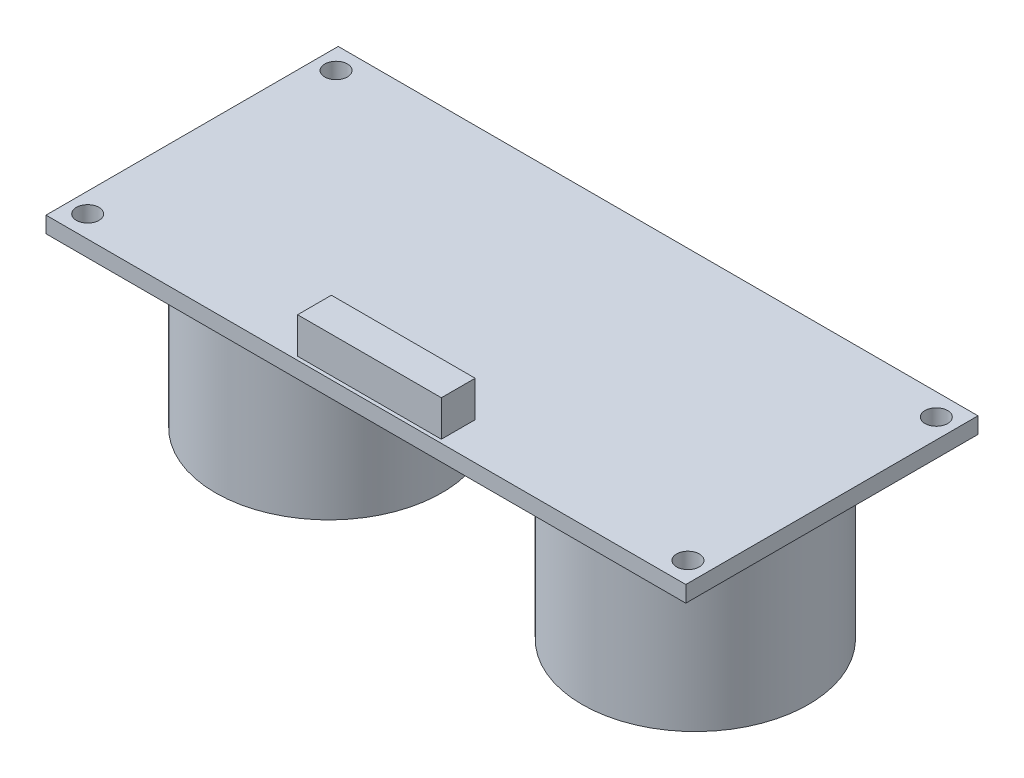
ISO-10303-21;
HEADER;
FILE_DESCRIPTION(('STEP AP214'),'2;1');
FILE_NAME('part.step','',(''),(''),'','','');
FILE_SCHEMA(('AUTOMOTIVE_DESIGN { 1 0 10303 214 1 1 1 1 }'));
ENDSEC;
DATA;
#1=APPLICATION_CONTEXT('core data for automotive mechanical design processes');
#2=APPLICATION_PROTOCOL_DEFINITION('international standard','automotive_design',2000,#1);
#3=PRODUCT_CONTEXT('',#1,'mechanical');
#4=PRODUCT('Part','Part','',(#3));
#5=PRODUCT_RELATED_PRODUCT_CATEGORY('part','',(#4));
#6=PRODUCT_DEFINITION_FORMATION('','',#4);
#7=PRODUCT_DEFINITION_CONTEXT('part definition',#1,'design');
#8=PRODUCT_DEFINITION('design','',#6,#7);
#9=PRODUCT_DEFINITION_SHAPE('','',#8);
#10=(LENGTH_UNIT() NAMED_UNIT(*) SI_UNIT(.MILLI.,.METRE.));
#11=(NAMED_UNIT(*) PLANE_ANGLE_UNIT() SI_UNIT($,.RADIAN.));
#12=(NAMED_UNIT(*) SI_UNIT($,.STERADIAN.) SOLID_ANGLE_UNIT());
#13=UNCERTAINTY_MEASURE_WITH_UNIT(LENGTH_MEASURE(1.E-05),#10,'distance_accuracy_value','');
#14=(GEOMETRIC_REPRESENTATION_CONTEXT(3) GLOBAL_UNCERTAINTY_ASSIGNED_CONTEXT((#13)) GLOBAL_UNIT_ASSIGNED_CONTEXT((#10,
#11,#12)) REPRESENTATION_CONTEXT('',''));
#15=CARTESIAN_POINT('',(0.,0.,0.));
#16=DIRECTION('',(0.,0.,1.));
#17=DIRECTION('',(1.,0.,0.));
#18=AXIS2_PLACEMENT_3D('',#15,#16,#17);
#19=CARTESIAN_POINT('',(0.,0.5715,0.));
#20=DIRECTION('',(0.,1.,0.));
#21=DIRECTION('',(0.,0.,1.));
#22=AXIS2_PLACEMENT_3D('',#19,#20,#21);
#23=PLANE('',#22);
#24=DIRECTION('',(0.,0.,1.));
#25=VECTOR('',#24,1.);
#26=CARTESIAN_POINT('',(22.606,0.5715,0.));
#27=LINE('',#26,#25);
#28=CARTESIAN_POINT('',(22.606,0.5715,-10.3251));
#29=VERTEX_POINT('',#28);
#30=CARTESIAN_POINT('',(22.606,0.5715,10.3251));
#31=VERTEX_POINT('',#30);
#32=EDGE_CURVE('E150',#29,#31,#27,.T.);
#33=ORIENTED_EDGE('',*,*,#32,.F.);
#34=DIRECTION('',(-1.,0.,0.));
#35=VECTOR('',#34,1.);
#36=CARTESIAN_POINT('',(0.,0.5715,-10.3251));
#37=LINE('',#36,#35);
#38=CARTESIAN_POINT('',(-22.606,0.5715,-10.3251));
#39=VERTEX_POINT('',#38);
#40=EDGE_CURVE('E194',#29,#39,#37,.T.);
#41=ORIENTED_EDGE('',*,*,#40,.T.);
#42=DIRECTION('',(0.,0.,1.));
#43=VECTOR('',#42,1.);
#44=CARTESIAN_POINT('',(-22.606,0.5715,0.));
#45=LINE('',#44,#43);
#46=CARTESIAN_POINT('',(-22.606,0.5715,10.3251));
#47=VERTEX_POINT('',#46);
#48=EDGE_CURVE('E196',#39,#47,#45,.T.);
#49=ORIENTED_EDGE('',*,*,#48,.T.);
#50=DIRECTION('',(-1.,0.,0.));
#51=VECTOR('',#50,1.);
#52=CARTESIAN_POINT('',(0.,0.5715,10.3251));
#53=LINE('',#52,#51);
#54=EDGE_CURVE('E179',#31,#47,#53,.T.);
#55=ORIENTED_EDGE('',*,*,#54,.F.);
#56=EDGE_LOOP('',(#33,#41,#49,#55));
#57=FACE_BOUND('',#56,.T.);
#58=DIRECTION('',(-1.,0.,0.));
#59=VECTOR('',#58,1.);
#60=CARTESIAN_POINT('',(-5.08,0.5715,7.6835));
#61=LINE('',#60,#59);
#62=CARTESIAN_POINT('',(5.08,0.5715,7.6835));
#63=VERTEX_POINT('',#62);
#64=CARTESIAN_POINT('',(-5.08,0.5715,7.6835));
#65=VERTEX_POINT('',#64);
#66=EDGE_CURVE('E161',#63,#65,#61,.T.);
#67=ORIENTED_EDGE('',*,*,#66,.F.);
#68=DIRECTION('',(0.,0.,1.));
#69=VECTOR('',#68,1.);
#70=CARTESIAN_POINT('',(5.08,0.5715,10.0711));
#71=LINE('',#70,#69);
#72=CARTESIAN_POINT('',(5.08,0.5715,10.0711));
#73=VERTEX_POINT('',#72);
#74=EDGE_CURVE('E126',#63,#73,#71,.T.);
#75=ORIENTED_EDGE('',*,*,#74,.T.);
#76=DIRECTION('',(1.,0.,0.));
#77=VECTOR('',#76,1.);
#78=CARTESIAN_POINT('',(-5.08,0.5715,10.0711));
#79=LINE('',#78,#77);
#80=CARTESIAN_POINT('',(-5.08,0.5715,10.0711));
#81=VERTEX_POINT('',#80);
#82=EDGE_CURVE('E60',#81,#73,#79,.T.);
#83=ORIENTED_EDGE('',*,*,#82,.F.);
#84=DIRECTION('',(0.,0.,1.));
#85=VECTOR('',#84,1.);
#86=CARTESIAN_POINT('',(-5.08,0.5715,10.0711));
#87=LINE('',#86,#85);
#88=EDGE_CURVE('E55',#65,#81,#87,.T.);
#89=ORIENTED_EDGE('',*,*,#88,.F.);
#90=EDGE_LOOP('',(#67,#75,#83,#89));
#91=FACE_BOUND('',#90,.T.);
#92=CARTESIAN_POINT('',(-21.209,0.5715,-8.7757));
#93=DIRECTION('',(0.,1.,0.));
#94=DIRECTION('',(0.,0.,1.));
#95=AXIS2_PLACEMENT_3D('',#92,#93,#94);
#96=CIRCLE('',#95,0.799999999999999);
#97=CARTESIAN_POINT('',(-21.209,0.5715,-7.9757));
#98=VERTEX_POINT('',#97);
#99=EDGE_CURVE('E188',#98,#98,#96,.T.);
#100=ORIENTED_EDGE('',*,*,#99,.F.);
#101=EDGE_LOOP('',(#100));
#102=FACE_BOUND('',#101,.T.);
#103=CARTESIAN_POINT('',(-21.209,0.5715,8.7757));
#104=DIRECTION('',(0.,-1.,0.));
#105=DIRECTION('',(0.,0.,-1.));
#106=AXIS2_PLACEMENT_3D('',#103,#104,#105);
#107=CIRCLE('',#106,0.799999999999999);
#108=CARTESIAN_POINT('',(-21.209,0.5715,7.9757));
#109=VERTEX_POINT('',#108);
#110=EDGE_CURVE('E173',#109,#109,#107,.T.);
#111=ORIENTED_EDGE('',*,*,#110,.T.);
#112=EDGE_LOOP('',(#111));
#113=FACE_BOUND('',#112,.T.);
#114=CARTESIAN_POINT('',(21.209,0.5715,-8.7757));
#115=DIRECTION('',(0.,-1.,0.));
#116=DIRECTION('',(0.,0.,1.));
#117=AXIS2_PLACEMENT_3D('',#114,#115,#116);
#118=CIRCLE('',#117,0.799999999999999);
#119=CARTESIAN_POINT('',(21.209,0.5715,-7.9757));
#120=VERTEX_POINT('',#119);
#121=EDGE_CURVE('E144',#120,#120,#118,.T.);
#122=ORIENTED_EDGE('',*,*,#121,.T.);
#123=EDGE_LOOP('',(#122));
#124=FACE_BOUND('',#123,.T.);
#125=CARTESIAN_POINT('',(21.209,0.5715,8.7757));
#126=DIRECTION('',(0.,1.,0.));
#127=DIRECTION('',(0.,0.,-1.));
#128=AXIS2_PLACEMENT_3D('',#125,#126,#127);
#129=CIRCLE('',#128,0.799999999999999);
#130=CARTESIAN_POINT('',(21.209,0.5715,7.9757));
#131=VERTEX_POINT('',#130);
#132=EDGE_CURVE('E135',#131,#131,#129,.T.);
#133=ORIENTED_EDGE('',*,*,#132,.F.);
#134=EDGE_LOOP('',(#133));
#135=FACE_BOUND('',#134,.T.);
#136=ADVANCED_FACE('F39',(#57,#91,#102,#113,#124,#135),#23,.T.);
#137=CARTESIAN_POINT('',(0.,-0.5715,0.));
#138=DIRECTION('',(0.,1.,0.));
#139=DIRECTION('',(0.,0.,1.));
#140=AXIS2_PLACEMENT_3D('',#137,#138,#139);
#141=PLANE('',#140);
#142=CARTESIAN_POINT('',(-12.954,-0.5715,0.));
#143=DIRECTION('',(0.,-1.,0.));
#144=DIRECTION('',(0.,0.,-1.));
#145=AXIS2_PLACEMENT_3D('',#142,#143,#144);
#146=CIRCLE('',#145,8.001);
#147=CARTESIAN_POINT('',(-12.954,-0.571500000000001,8.001));
#148=VERTEX_POINT('',#147);
#149=EDGE_CURVE('E11',#148,#148,#146,.T.);
#150=ORIENTED_EDGE('',*,*,#149,.F.);
#151=EDGE_LOOP('',(#150));
#152=FACE_BOUND('',#151,.T.);
#153=DIRECTION('',(-1.,0.,0.));
#154=VECTOR('',#153,1.);
#155=CARTESIAN_POINT('',(0.,-0.5715,-10.3251));
#156=LINE('',#155,#154);
#157=CARTESIAN_POINT('',(22.606,-0.5715,-10.3251));
#158=VERTEX_POINT('',#157);
#159=CARTESIAN_POINT('',(-22.606,-0.5715,-10.3251));
#160=VERTEX_POINT('',#159);
#161=EDGE_CURVE('E191',#158,#160,#156,.T.);
#162=ORIENTED_EDGE('',*,*,#161,.F.);
#163=DIRECTION('',(0.,0.,1.));
#164=VECTOR('',#163,1.);
#165=CARTESIAN_POINT('',(22.606,-0.5715,0.));
#166=LINE('',#165,#164);
#167=CARTESIAN_POINT('',(22.606,-0.5715,10.3251));
#168=VERTEX_POINT('',#167);
#169=EDGE_CURVE('E147',#158,#168,#166,.T.);
#170=ORIENTED_EDGE('',*,*,#169,.T.);
#171=DIRECTION('',(-1.,0.,0.));
#172=VECTOR('',#171,1.);
#173=CARTESIAN_POINT('',(0.,-0.5715,10.3251));
#174=LINE('',#173,#172);
#175=CARTESIAN_POINT('',(-22.606,-0.5715,10.3251));
#176=VERTEX_POINT('',#175);
#177=EDGE_CURVE('E176',#168,#176,#174,.T.);
#178=ORIENTED_EDGE('',*,*,#177,.T.);
#179=DIRECTION('',(0.,0.,1.));
#180=VECTOR('',#179,1.);
#181=CARTESIAN_POINT('',(-22.606,-0.5715,0.));
#182=LINE('',#181,#180);
#183=EDGE_CURVE('E197',#160,#176,#182,.T.);
#184=ORIENTED_EDGE('',*,*,#183,.F.);
#185=EDGE_LOOP('',(#162,#170,#178,#184));
#186=FACE_BOUND('',#185,.T.);
#187=CARTESIAN_POINT('',(-21.209,-0.5715,-8.7757));
#188=DIRECTION('',(0.,1.,0.));
#189=DIRECTION('',(0.,0.,1.));
#190=AXIS2_PLACEMENT_3D('',#187,#188,#189);
#191=CIRCLE('',#190,0.799999999999999);
#192=CARTESIAN_POINT('',(-21.209,-0.5715,-7.9757));
#193=VERTEX_POINT('',#192);
#194=EDGE_CURVE('E187',#193,#193,#191,.T.);
#195=ORIENTED_EDGE('',*,*,#194,.T.);
#196=EDGE_LOOP('',(#195));
#197=FACE_BOUND('',#196,.T.);
#198=CARTESIAN_POINT('',(-21.209,-0.5715,8.7757));
#199=DIRECTION('',(0.,-1.,0.));
#200=DIRECTION('',(0.,0.,-1.));
#201=AXIS2_PLACEMENT_3D('',#198,#199,#200);
#202=CIRCLE('',#201,0.799999999999999);
#203=CARTESIAN_POINT('',(-21.209,-0.5715,7.9757));
#204=VERTEX_POINT('',#203);
#205=EDGE_CURVE('E172',#204,#204,#202,.T.);
#206=ORIENTED_EDGE('',*,*,#205,.F.);
#207=EDGE_LOOP('',(#206));
#208=FACE_BOUND('',#207,.T.);
#209=CARTESIAN_POINT('',(12.954,-0.5715,0.));
#210=DIRECTION('',(0.,1.,0.));
#211=DIRECTION('',(0.,0.,-1.));
#212=AXIS2_PLACEMENT_3D('',#209,#210,#211);
#213=CIRCLE('',#212,8.001);
#214=CARTESIAN_POINT('',(12.954,-0.571500000000001,8.001));
#215=VERTEX_POINT('',#214);
#216=EDGE_CURVE('E132',#215,#215,#213,.T.);
#217=ORIENTED_EDGE('',*,*,#216,.T.);
#218=EDGE_LOOP('',(#217));
#219=FACE_BOUND('',#218,.T.);
#220=CARTESIAN_POINT('',(21.209,-0.5715,-8.7757));
#221=DIRECTION('',(0.,-1.,0.));
#222=DIRECTION('',(0.,0.,1.));
#223=AXIS2_PLACEMENT_3D('',#220,#221,#222);
#224=CIRCLE('',#223,0.799999999999999);
#225=CARTESIAN_POINT('',(21.209,-0.5715,-7.9757));
#226=VERTEX_POINT('',#225);
#227=EDGE_CURVE('E143',#226,#226,#224,.T.);
#228=ORIENTED_EDGE('',*,*,#227,.F.);
#229=EDGE_LOOP('',(#228));
#230=FACE_BOUND('',#229,.T.);
#231=CARTESIAN_POINT('',(21.209,-0.5715,8.7757));
#232=DIRECTION('',(0.,1.,0.));
#233=DIRECTION('',(0.,0.,-1.));
#234=AXIS2_PLACEMENT_3D('',#231,#232,#233);
#235=CIRCLE('',#234,0.799999999999999);
#236=CARTESIAN_POINT('',(21.209,-0.5715,7.9757));
#237=VERTEX_POINT('',#236);
#238=EDGE_CURVE('E121',#237,#237,#235,.T.);
#239=ORIENTED_EDGE('',*,*,#238,.T.);
#240=EDGE_LOOP('',(#239));
#241=FACE_BOUND('',#240,.T.);
#242=ADVANCED_FACE('F210',(#152,#186,#197,#208,#219,#230,#241),#141,.F.);
#243=CARTESIAN_POINT('',(0.,0.5715,-10.3251));
#244=DIRECTION('',(0.,0.,1.));
#245=DIRECTION('',(1.,0.,0.));
#246=AXIS2_PLACEMENT_3D('',#243,#244,#245);
#247=PLANE('',#246);
#248=ORIENTED_EDGE('',*,*,#161,.T.);
#249=DIRECTION('',(0.,-1.,0.));
#250=VECTOR('',#249,1.);
#251=CARTESIAN_POINT('',(-22.606,0.5715,-10.3251));
#252=LINE('',#251,#250);
#253=EDGE_CURVE('E43',#39,#160,#252,.T.);
#254=ORIENTED_EDGE('',*,*,#253,.F.);
#255=ORIENTED_EDGE('',*,*,#40,.F.);
#256=DIRECTION('',(0.,-1.,0.));
#257=VECTOR('',#256,1.);
#258=CARTESIAN_POINT('',(22.606,0.5715,-10.3251));
#259=LINE('',#258,#257);
#260=EDGE_CURVE('E153',#29,#158,#259,.T.);
#261=ORIENTED_EDGE('',*,*,#260,.T.);
#262=EDGE_LOOP('',(#248,#254,#255,#261));
#263=FACE_BOUND('',#262,.T.);
#264=ADVANCED_FACE('F41',(#263),#247,.F.);
#265=CARTESIAN_POINT('',(-22.606,0.5715,0.));
#266=DIRECTION('',(1.,0.,0.));
#267=DIRECTION('',(0.,0.,-1.));
#268=AXIS2_PLACEMENT_3D('',#265,#266,#267);
#269=PLANE('',#268);
#270=ORIENTED_EDGE('',*,*,#183,.T.);
#271=DIRECTION('',(0.,-1.,0.));
#272=VECTOR('',#271,1.);
#273=CARTESIAN_POINT('',(-22.606,0.5715,10.3251));
#274=LINE('',#273,#272);
#275=EDGE_CURVE('E182',#47,#176,#274,.T.);
#276=ORIENTED_EDGE('',*,*,#275,.F.);
#277=ORIENTED_EDGE('',*,*,#48,.F.);
#278=ORIENTED_EDGE('',*,*,#253,.T.);
#279=EDGE_LOOP('',(#270,#276,#277,#278));
#280=FACE_BOUND('',#279,.T.);
#281=ADVANCED_FACE('F203',(#280),#269,.F.);
#282=CARTESIAN_POINT('',(-21.209,0.5715,-8.7757));
#283=DIRECTION('',(0.,-1.,0.));
#284=DIRECTION('',(0.,0.,-1.));
#285=AXIS2_PLACEMENT_3D('',#282,#283,#284);
#286=CYLINDRICAL_SURFACE('',#285,0.799999999999999);
#287=ORIENTED_EDGE('',*,*,#99,.T.);
#288=EDGE_LOOP('',(#287));
#289=FACE_BOUND('',#288,.T.);
#290=ORIENTED_EDGE('',*,*,#194,.F.);
#291=EDGE_LOOP('',(#290));
#292=FACE_BOUND('',#291,.T.);
#293=ADVANCED_FACE('F224',(#289,#292),#286,.F.);
#294=CARTESIAN_POINT('',(0.,0.5715,10.3251));
#295=DIRECTION('',(0.,0.,1.));
#296=DIRECTION('',(1.,0.,0.));
#297=AXIS2_PLACEMENT_3D('',#294,#295,#296);
#298=PLANE('',#297);
#299=ORIENTED_EDGE('',*,*,#177,.F.);
#300=DIRECTION('',(0.,-1.,0.));
#301=VECTOR('',#300,1.);
#302=CARTESIAN_POINT('',(22.606,0.5715,10.3251));
#303=LINE('',#302,#301);
#304=EDGE_CURVE('E138',#31,#168,#303,.T.);
#305=ORIENTED_EDGE('',*,*,#304,.F.);
#306=ORIENTED_EDGE('',*,*,#54,.T.);
#307=ORIENTED_EDGE('',*,*,#275,.T.);
#308=EDGE_LOOP('',(#299,#305,#306,#307));
#309=FACE_BOUND('',#308,.T.);
#310=ADVANCED_FACE('F208',(#309),#298,.T.);
#311=CARTESIAN_POINT('',(-21.209,0.5715,8.7757));
#312=DIRECTION('',(0.,-1.,0.));
#313=DIRECTION('',(0.,0.,-1.));
#314=AXIS2_PLACEMENT_3D('',#311,#312,#313);
#315=CYLINDRICAL_SURFACE('',#314,0.799999999999999);
#316=ORIENTED_EDGE('',*,*,#110,.F.);
#317=EDGE_LOOP('',(#316));
#318=FACE_BOUND('',#317,.T.);
#319=ORIENTED_EDGE('',*,*,#205,.T.);
#320=EDGE_LOOP('',(#319));
#321=FACE_BOUND('',#320,.T.);
#322=ADVANCED_FACE('F237',(#318,#321),#315,.F.);
#323=CARTESIAN_POINT('',(-5.08,3.1115,10.0711));
#324=DIRECTION('',(1.,0.,0.));
#325=DIRECTION('',(0.,0.,-1.));
#326=AXIS2_PLACEMENT_3D('',#323,#324,#325);
#327=PLANE('',#326);
#328=ORIENTED_EDGE('',*,*,#88,.T.);
#329=DIRECTION('',(0.,-1.,0.));
#330=VECTOR('',#329,1.);
#331=CARTESIAN_POINT('',(-5.08,3.1115,10.0711));
#332=LINE('',#331,#330);
#333=CARTESIAN_POINT('',(-5.08,3.1115,10.0711));
#334=VERTEX_POINT('',#333);
#335=EDGE_CURVE('E170',#334,#81,#332,.T.);
#336=ORIENTED_EDGE('',*,*,#335,.F.);
#337=DIRECTION('',(0.,0.,1.));
#338=VECTOR('',#337,1.);
#339=CARTESIAN_POINT('',(-5.08,3.1115,10.0711));
#340=LINE('',#339,#338);
#341=CARTESIAN_POINT('',(-5.08,3.1115,7.6835));
#342=VERTEX_POINT('',#341);
#343=EDGE_CURVE('E111',#342,#334,#340,.T.);
#344=ORIENTED_EDGE('',*,*,#343,.F.);
#345=DIRECTION('',(0.,-1.,0.));
#346=VECTOR('',#345,1.);
#347=CARTESIAN_POINT('',(-5.08,3.1115,7.6835));
#348=LINE('',#347,#346);
#349=EDGE_CURVE('E164',#342,#65,#348,.T.);
#350=ORIENTED_EDGE('',*,*,#349,.T.);
#351=EDGE_LOOP('',(#328,#336,#344,#350));
#352=FACE_BOUND('',#351,.T.);
#353=ADVANCED_FACE('F240',(#352),#327,.F.);
#354=CARTESIAN_POINT('',(-5.08,3.1115,10.0711));
#355=DIRECTION('',(0.,0.,-1.));
#356=DIRECTION('',(-1.,0.,0.));
#357=AXIS2_PLACEMENT_3D('',#354,#355,#356);
#358=PLANE('',#357);
#359=ORIENTED_EDGE('',*,*,#82,.T.);
#360=DIRECTION('',(0.,-1.,0.));
#361=VECTOR('',#360,1.);
#362=CARTESIAN_POINT('',(5.08,3.1115,10.0711));
#363=LINE('',#362,#361);
#364=CARTESIAN_POINT('',(5.08,3.1115,10.0711));
#365=VERTEX_POINT('',#364);
#366=EDGE_CURVE('E117',#365,#73,#363,.T.);
#367=ORIENTED_EDGE('',*,*,#366,.F.);
#368=DIRECTION('',(1.,0.,0.));
#369=VECTOR('',#368,1.);
#370=CARTESIAN_POINT('',(-5.08,3.1115,10.0711));
#371=LINE('',#370,#369);
#372=EDGE_CURVE('E104',#334,#365,#371,.T.);
#373=ORIENTED_EDGE('',*,*,#372,.F.);
#374=ORIENTED_EDGE('',*,*,#335,.T.);
#375=EDGE_LOOP('',(#359,#367,#373,#374));
#376=FACE_BOUND('',#375,.T.);
#377=ADVANCED_FACE('F118',(#376),#358,.F.);
#378=CARTESIAN_POINT('',(-5.08,3.1115,7.6835));
#379=DIRECTION('',(0.,0.,1.));
#380=DIRECTION('',(1.,0.,0.));
#381=AXIS2_PLACEMENT_3D('',#378,#379,#380);
#382=PLANE('',#381);
#383=ORIENTED_EDGE('',*,*,#66,.T.);
#384=ORIENTED_EDGE('',*,*,#349,.F.);
#385=DIRECTION('',(-1.,0.,0.));
#386=VECTOR('',#385,1.);
#387=CARTESIAN_POINT('',(-5.08,3.1115,7.6835));
#388=LINE('',#387,#386);
#389=CARTESIAN_POINT('',(5.08,3.1115,7.6835));
#390=VERTEX_POINT('',#389);
#391=EDGE_CURVE('E114',#390,#342,#388,.T.);
#392=ORIENTED_EDGE('',*,*,#391,.F.);
#393=DIRECTION('',(0.,-1.,0.));
#394=VECTOR('',#393,1.);
#395=CARTESIAN_POINT('',(5.08,3.1115,7.6835));
#396=LINE('',#395,#394);
#397=EDGE_CURVE('E122',#390,#63,#396,.T.);
#398=ORIENTED_EDGE('',*,*,#397,.T.);
#399=EDGE_LOOP('',(#383,#384,#392,#398));
#400=FACE_BOUND('',#399,.T.);
#401=ADVANCED_FACE('F247',(#400),#382,.F.);
#402=CARTESIAN_POINT('',(0.,3.1115,0.));
#403=DIRECTION('',(0.,-1.,0.));
#404=DIRECTION('',(0.,0.,-1.));
#405=AXIS2_PLACEMENT_3D('',#402,#403,#404);
#406=PLANE('',#405);
#407=ORIENTED_EDGE('',*,*,#343,.T.);
#408=ORIENTED_EDGE('',*,*,#372,.T.);
#409=DIRECTION('',(0.,0.,1.));
#410=VECTOR('',#409,1.);
#411=CARTESIAN_POINT('',(5.08,3.1115,10.0711));
#412=LINE('',#411,#410);
#413=EDGE_CURVE('E108',#390,#365,#412,.T.);
#414=ORIENTED_EDGE('',*,*,#413,.F.);
#415=ORIENTED_EDGE('',*,*,#391,.T.);
#416=EDGE_LOOP('',(#407,#408,#414,#415));
#417=FACE_BOUND('',#416,.T.);
#418=ADVANCED_FACE('F106',(#417),#406,.F.);
#419=CARTESIAN_POINT('',(-12.954,-12.7635,0.));
#420=DIRECTION('',(0.,1.,0.));
#421=DIRECTION('',(0.,0.,1.));
#422=AXIS2_PLACEMENT_3D('',#419,#420,#421);
#423=CYLINDRICAL_SURFACE('',#422,8.001);
#424=CARTESIAN_POINT('',(-12.954,-12.7635,0.));
#425=DIRECTION('',(0.,-1.,0.));
#426=DIRECTION('',(0.,0.,-1.));
#427=AXIS2_PLACEMENT_3D('',#424,#425,#426);
#428=CIRCLE('',#427,8.001);
#429=CARTESIAN_POINT('',(-12.954,-12.7635,8.001));
#430=VERTEX_POINT('',#429);
#431=EDGE_CURVE('E158',#430,#430,#428,.T.);
#432=CARTESIAN_POINT('',(-12.954,-12.7635,8.001));
#433=CARTESIAN_POINT('',(-12.954,-12.6365,8.001));
#434=CARTESIAN_POINT('',(-12.954,-12.5095,8.001));
#435=CARTESIAN_POINT('',(-12.954,-12.2555,8.001));
#436=CARTESIAN_POINT('',(-12.954,-12.1285,8.001));
#437=CARTESIAN_POINT('',(-12.954,-11.8745,8.001));
#438=CARTESIAN_POINT('',(-12.954,-11.7475,8.001));
#439=CARTESIAN_POINT('',(-12.954,-11.4935,8.001));
#440=CARTESIAN_POINT('',(-12.954,-11.3665,8.001));
#441=CARTESIAN_POINT('',(-12.954,-11.1125,8.001));
#442=CARTESIAN_POINT('',(-12.954,-10.9855,8.001));
#443=CARTESIAN_POINT('',(-12.954,-10.7315,8.001));
#444=CARTESIAN_POINT('',(-12.954,-10.6045,8.001));
#445=CARTESIAN_POINT('',(-12.954,-10.3505,8.001));
#446=CARTESIAN_POINT('',(-12.954,-10.2235,8.001));
#447=CARTESIAN_POINT('',(-12.954,-9.9695,8.001));
#448=CARTESIAN_POINT('',(-12.954,-9.8425,8.001));
#449=CARTESIAN_POINT('',(-12.954,-9.5885,8.001));
#450=CARTESIAN_POINT('',(-12.954,-9.4615,8.001));
#451=CARTESIAN_POINT('',(-12.954,-9.2075,8.001));
#452=CARTESIAN_POINT('',(-12.954,-9.0805,8.001));
#453=CARTESIAN_POINT('',(-12.954,-8.8265,8.001));
#454=CARTESIAN_POINT('',(-12.954,-8.6995,8.001));
#455=CARTESIAN_POINT('',(-12.954,-8.4455,8.001));
#456=CARTESIAN_POINT('',(-12.954,-8.3185,8.001));
#457=CARTESIAN_POINT('',(-12.954,-8.0645,8.001));
#458=CARTESIAN_POINT('',(-12.954,-7.9375,8.001));
#459=CARTESIAN_POINT('',(-12.954,-7.6835,8.001));
#460=CARTESIAN_POINT('',(-12.954,-7.5565,8.001));
#461=CARTESIAN_POINT('',(-12.954,-7.3025,8.001));
#462=CARTESIAN_POINT('',(-12.954,-7.1755,8.001));
#463=CARTESIAN_POINT('',(-12.954,-6.9215,8.001));
#464=CARTESIAN_POINT('',(-12.954,-6.7945,8.001));
#465=CARTESIAN_POINT('',(-12.954,-6.5405,8.001));
#466=CARTESIAN_POINT('',(-12.954,-6.4135,8.001));
#467=CARTESIAN_POINT('',(-12.954,-6.1595,8.001));
#468=CARTESIAN_POINT('',(-12.954,-6.0325,8.001));
#469=CARTESIAN_POINT('',(-12.954,-5.7785,8.001));
#470=CARTESIAN_POINT('',(-12.954,-5.6515,8.001));
#471=CARTESIAN_POINT('',(-12.954,-5.3975,8.001));
#472=CARTESIAN_POINT('',(-12.954,-5.2705,8.001));
#473=CARTESIAN_POINT('',(-12.954,-5.0165,8.001));
#474=CARTESIAN_POINT('',(-12.954,-4.8895,8.001));
#475=CARTESIAN_POINT('',(-12.954,-4.6355,8.001));
#476=CARTESIAN_POINT('',(-12.954,-4.5085,8.001));
#477=CARTESIAN_POINT('',(-12.954,-4.2545,8.001));
#478=CARTESIAN_POINT('',(-12.954,-4.1275,8.001));
#479=CARTESIAN_POINT('',(-12.954,-3.8735,8.001));
#480=CARTESIAN_POINT('',(-12.954,-3.7465,8.001));
#481=CARTESIAN_POINT('',(-12.954,-3.4925,8.001));
#482=CARTESIAN_POINT('',(-12.954,-3.3655,8.001));
#483=CARTESIAN_POINT('',(-12.954,-3.1115,8.001));
#484=CARTESIAN_POINT('',(-12.954,-2.9845,8.001));
#485=CARTESIAN_POINT('',(-12.954,-2.7305,8.001));
#486=CARTESIAN_POINT('',(-12.954,-2.6035,8.001));
#487=CARTESIAN_POINT('',(-12.954,-2.3495,8.001));
#488=CARTESIAN_POINT('',(-12.954,-2.2225,8.001));
#489=CARTESIAN_POINT('',(-12.954,-1.9685,8.001));
#490=CARTESIAN_POINT('',(-12.954,-1.8415,8.001));
#491=CARTESIAN_POINT('',(-12.954,-1.5875,8.001));
#492=CARTESIAN_POINT('',(-12.954,-1.4605,8.001));
#493=CARTESIAN_POINT('',(-12.954,-1.2065,8.001));
#494=CARTESIAN_POINT('',(-12.954,-1.0795,8.001));
#495=CARTESIAN_POINT('',(-12.954,-0.8255,8.001));
#496=CARTESIAN_POINT('',(-12.954,-0.698500000000001,8.001));
#497=CARTESIAN_POINT('',(-12.954,-0.571500000000001,8.001));
#498=B_SPLINE_CURVE_WITH_KNOTS('',3,(#432,#433,#434,#435,#436,#437,#438,#439,#440,#441,#442,
#443,#444,#445,#446,#447,#448,#449,#450,#451,#452,#453,#454,#455,#456,#457,#458,#459,#460,#461,
#462,#463,#464,#465,#466,#467,#468,#469,#470,#471,#472,#473,#474,#475,#476,#477,#478,#479,#480,
#481,#482,#483,#484,#485,#486,#487,#488,#489,#490,#491,#492,#493,#494,#495,#496,#497),
.UNSPECIFIED.,.F.,.F.,(4,2,2,2,2,2,2,2,2,2,2,2,2,2,2,2,2,2,2,2,2,2,2,2,2,2,2,2,2,2,2,2,4),(0.,
0.380999999999999,0.761999999999999,1.143,1.524,1.905,2.286,2.667,3.048,3.429,3.81,4.191,4.572,
4.953,5.334,5.715,6.096,6.477,6.858,7.239,7.62,8.001,8.382,8.763,9.144,9.525,9.906,10.287,
10.668,11.049,11.43,11.811,12.192),.UNSPECIFIED.);
#499=EDGE_CURVE('BSEAM253',#430,#148,#498,.T.);
#500=ORIENTED_EDGE('',*,*,#431,.F.);
#501=ORIENTED_EDGE('',*,*,#149,.T.);
#502=ORIENTED_EDGE('',*,*,#499,.T.);
#503=ORIENTED_EDGE('',*,*,#499,.F.);
#504=EDGE_LOOP('',(#500,#502,#501,#503));
#505=FACE_BOUND('',#504,.T.);
#506=ADVANCED_FACE('F253',(#505),#423,.T.);
#507=CARTESIAN_POINT('',(-12.954,-12.7635,0.));
#508=DIRECTION('',(0.,-1.,0.));
#509=DIRECTION('',(0.,0.,-1.));
#510=AXIS2_PLACEMENT_3D('',#507,#508,#509);
#511=PLANE('',#510);
#512=ORIENTED_EDGE('',*,*,#431,.T.);
#513=EDGE_LOOP('',(#512));
#514=FACE_BOUND('',#513,.T.);
#515=ADVANCED_FACE('F256',(#514),#511,.T.);
#516=CARTESIAN_POINT('',(22.606,0.5715,0.));
#517=DIRECTION('',(-1.,0.,0.));
#518=DIRECTION('',(0.,0.,-1.));
#519=AXIS2_PLACEMENT_3D('',#516,#517,#518);
#520=PLANE('',#519);
#521=ORIENTED_EDGE('',*,*,#169,.F.);
#522=ORIENTED_EDGE('',*,*,#260,.F.);
#523=ORIENTED_EDGE('',*,*,#32,.T.);
#524=ORIENTED_EDGE('',*,*,#304,.T.);
#525=EDGE_LOOP('',(#521,#522,#523,#524));
#526=FACE_BOUND('',#525,.T.);
#527=ADVANCED_FACE('F215',(#526),#520,.F.);
#528=CARTESIAN_POINT('',(21.209,0.5715,-8.7757));
#529=DIRECTION('',(0.,-1.,0.));
#530=DIRECTION('',(0.,0.,-1.));
#531=AXIS2_PLACEMENT_3D('',#528,#529,#530);
#532=CYLINDRICAL_SURFACE('',#531,0.799999999999999);
#533=ORIENTED_EDGE('',*,*,#121,.F.);
#534=EDGE_LOOP('',(#533));
#535=FACE_BOUND('',#534,.T.);
#536=ORIENTED_EDGE('',*,*,#227,.T.);
#537=EDGE_LOOP('',(#536));
#538=FACE_BOUND('',#537,.T.);
#539=ADVANCED_FACE('F263',(#535,#538),#532,.F.);
#540=CARTESIAN_POINT('',(21.209,0.5715,8.7757));
#541=DIRECTION('',(0.,-1.,0.));
#542=DIRECTION('',(0.,0.,-1.));
#543=AXIS2_PLACEMENT_3D('',#540,#541,#542);
#544=CYLINDRICAL_SURFACE('',#543,0.799999999999999);
#545=ORIENTED_EDGE('',*,*,#132,.T.);
#546=EDGE_LOOP('',(#545));
#547=FACE_BOUND('',#546,.T.);
#548=ORIENTED_EDGE('',*,*,#238,.F.);
#549=EDGE_LOOP('',(#548));
#550=FACE_BOUND('',#549,.T.);
#551=ADVANCED_FACE('F266',(#547,#550),#544,.F.);
#552=CARTESIAN_POINT('',(5.08,3.1115,10.0711));
#553=DIRECTION('',(-1.,0.,0.));
#554=DIRECTION('',(0.,0.,-1.));
#555=AXIS2_PLACEMENT_3D('',#552,#553,#554);
#556=PLANE('',#555);
#557=ORIENTED_EDGE('',*,*,#74,.F.);
#558=ORIENTED_EDGE('',*,*,#397,.F.);
#559=ORIENTED_EDGE('',*,*,#413,.T.);
#560=ORIENTED_EDGE('',*,*,#366,.T.);
#561=EDGE_LOOP('',(#557,#558,#559,#560));
#562=FACE_BOUND('',#561,.T.);
#563=ADVANCED_FACE('F124',(#562),#556,.F.);
#564=CARTESIAN_POINT('',(12.954,-12.7635,0.));
#565=DIRECTION('',(0.,1.,0.));
#566=DIRECTION('',(0.,0.,1.));
#567=AXIS2_PLACEMENT_3D('',#564,#565,#566);
#568=CYLINDRICAL_SURFACE('',#567,8.001);
#569=CARTESIAN_POINT('',(12.954,-12.7635,0.));
#570=DIRECTION('',(0.,1.,0.));
#571=DIRECTION('',(0.,0.,-1.));
#572=AXIS2_PLACEMENT_3D('',#569,#570,#571);
#573=CIRCLE('',#572,8.001);
#574=CARTESIAN_POINT('',(12.954,-12.7635,8.001));
#575=VERTEX_POINT('',#574);
#576=EDGE_CURVE('E129',#575,#575,#573,.T.);
#577=CARTESIAN_POINT('',(12.954,-12.7635,8.001));
#578=CARTESIAN_POINT('',(12.954,-12.6365,8.001));
#579=CARTESIAN_POINT('',(12.954,-12.5095,8.001));
#580=CARTESIAN_POINT('',(12.954,-12.2555,8.001));
#581=CARTESIAN_POINT('',(12.954,-12.1285,8.001));
#582=CARTESIAN_POINT('',(12.954,-11.8745,8.001));
#583=CARTESIAN_POINT('',(12.954,-11.7475,8.001));
#584=CARTESIAN_POINT('',(12.954,-11.4935,8.001));
#585=CARTESIAN_POINT('',(12.954,-11.3665,8.001));
#586=CARTESIAN_POINT('',(12.954,-11.1125,8.001));
#587=CARTESIAN_POINT('',(12.954,-10.9855,8.001));
#588=CARTESIAN_POINT('',(12.954,-10.7315,8.001));
#589=CARTESIAN_POINT('',(12.954,-10.6045,8.001));
#590=CARTESIAN_POINT('',(12.954,-10.3505,8.001));
#591=CARTESIAN_POINT('',(12.954,-10.2235,8.001));
#592=CARTESIAN_POINT('',(12.954,-9.9695,8.001));
#593=CARTESIAN_POINT('',(12.954,-9.8425,8.001));
#594=CARTESIAN_POINT('',(12.954,-9.5885,8.001));
#595=CARTESIAN_POINT('',(12.954,-9.4615,8.001));
#596=CARTESIAN_POINT('',(12.954,-9.2075,8.001));
#597=CARTESIAN_POINT('',(12.954,-9.0805,8.001));
#598=CARTESIAN_POINT('',(12.954,-8.8265,8.001));
#599=CARTESIAN_POINT('',(12.954,-8.6995,8.001));
#600=CARTESIAN_POINT('',(12.954,-8.4455,8.001));
#601=CARTESIAN_POINT('',(12.954,-8.3185,8.001));
#602=CARTESIAN_POINT('',(12.954,-8.0645,8.001));
#603=CARTESIAN_POINT('',(12.954,-7.9375,8.001));
#604=CARTESIAN_POINT('',(12.954,-7.6835,8.001));
#605=CARTESIAN_POINT('',(12.954,-7.5565,8.001));
#606=CARTESIAN_POINT('',(12.954,-7.3025,8.001));
#607=CARTESIAN_POINT('',(12.954,-7.1755,8.001));
#608=CARTESIAN_POINT('',(12.954,-6.9215,8.001));
#609=CARTESIAN_POINT('',(12.954,-6.7945,8.001));
#610=CARTESIAN_POINT('',(12.954,-6.5405,8.001));
#611=CARTESIAN_POINT('',(12.954,-6.4135,8.001));
#612=CARTESIAN_POINT('',(12.954,-6.1595,8.001));
#613=CARTESIAN_POINT('',(12.954,-6.0325,8.001));
#614=CARTESIAN_POINT('',(12.954,-5.7785,8.001));
#615=CARTESIAN_POINT('',(12.954,-5.6515,8.001));
#616=CARTESIAN_POINT('',(12.954,-5.3975,8.001));
#617=CARTESIAN_POINT('',(12.954,-5.2705,8.001));
#618=CARTESIAN_POINT('',(12.954,-5.0165,8.001));
#619=CARTESIAN_POINT('',(12.954,-4.8895,8.001));
#620=CARTESIAN_POINT('',(12.954,-4.6355,8.001));
#621=CARTESIAN_POINT('',(12.954,-4.5085,8.001));
#622=CARTESIAN_POINT('',(12.954,-4.2545,8.001));
#623=CARTESIAN_POINT('',(12.954,-4.1275,8.001));
#624=CARTESIAN_POINT('',(12.954,-3.8735,8.001));
#625=CARTESIAN_POINT('',(12.954,-3.7465,8.001));
#626=CARTESIAN_POINT('',(12.954,-3.4925,8.001));
#627=CARTESIAN_POINT('',(12.954,-3.3655,8.001));
#628=CARTESIAN_POINT('',(12.954,-3.1115,8.001));
#629=CARTESIAN_POINT('',(12.954,-2.9845,8.001));
#630=CARTESIAN_POINT('',(12.954,-2.7305,8.001));
#631=CARTESIAN_POINT('',(12.954,-2.6035,8.001));
#632=CARTESIAN_POINT('',(12.954,-2.3495,8.001));
#633=CARTESIAN_POINT('',(12.954,-2.2225,8.001));
#634=CARTESIAN_POINT('',(12.954,-1.9685,8.001));
#635=CARTESIAN_POINT('',(12.954,-1.8415,8.001));
#636=CARTESIAN_POINT('',(12.954,-1.5875,8.001));
#637=CARTESIAN_POINT('',(12.954,-1.4605,8.001));
#638=CARTESIAN_POINT('',(12.954,-1.2065,8.001));
#639=CARTESIAN_POINT('',(12.954,-1.0795,8.001));
#640=CARTESIAN_POINT('',(12.954,-0.8255,8.001));
#641=CARTESIAN_POINT('',(12.954,-0.698500000000001,8.001));
#642=CARTESIAN_POINT('',(12.954,-0.571500000000001,8.001));
#643=B_SPLINE_CURVE_WITH_KNOTS('',3,(#577,#578,#579,#580,#581,#582,#583,#584,#585,#586,#587,
#588,#589,#590,#591,#592,#593,#594,#595,#596,#597,#598,#599,#600,#601,#602,#603,#604,#605,#606,
#607,#608,#609,#610,#611,#612,#613,#614,#615,#616,#617,#618,#619,#620,#621,#622,#623,#624,#625,
#626,#627,#628,#629,#630,#631,#632,#633,#634,#635,#636,#637,#638,#639,#640,#641,#642),
.UNSPECIFIED.,.F.,.F.,(4,2,2,2,2,2,2,2,2,2,2,2,2,2,2,2,2,2,2,2,2,2,2,2,2,2,2,2,2,2,2,2,4),(0.,
0.380999999999999,0.761999999999999,1.143,1.524,1.905,2.286,2.667,3.048,3.429,3.81,4.191,4.572,
4.953,5.334,5.715,6.096,6.477,6.858,7.239,7.62,8.001,8.382,8.763,9.144,9.525,9.906,10.287,
10.668,11.049,11.43,11.811,12.192),.UNSPECIFIED.);
#644=EDGE_CURVE('BSEAM273',#575,#215,#643,.T.);
#645=ORIENTED_EDGE('',*,*,#576,.T.);
#646=ORIENTED_EDGE('',*,*,#216,.F.);
#647=ORIENTED_EDGE('',*,*,#644,.T.);
#648=ORIENTED_EDGE('',*,*,#644,.F.);
#649=EDGE_LOOP('',(#645,#647,#646,#648));
#650=FACE_BOUND('',#649,.T.);
#651=ADVANCED_FACE('F273',(#650),#568,.T.);
#652=CARTESIAN_POINT('',(12.954,-12.7635,0.));
#653=DIRECTION('',(0.,-1.,0.));
#654=DIRECTION('',(0.,0.,-1.));
#655=AXIS2_PLACEMENT_3D('',#652,#653,#654);
#656=PLANE('',#655);
#657=ORIENTED_EDGE('',*,*,#576,.F.);
#658=EDGE_LOOP('',(#657));
#659=FACE_BOUND('',#658,.T.);
#660=ADVANCED_FACE('F276',(#659),#656,.T.);
#661=CLOSED_SHELL('',(#136,#242,#264,#281,#293,#310,#322,#353,#377,#401,#418,#506,#515,#527,
#539,#551,#563,#651,#660));
#662=MANIFOLD_SOLID_BREP('B2',#661);
#663=ADVANCED_BREP_SHAPE_REPRESENTATION('',(#18,#662),#14);
#664=SHAPE_DEFINITION_REPRESENTATION(#9,#663);
ENDSEC;
END-ISO-10303-21;
